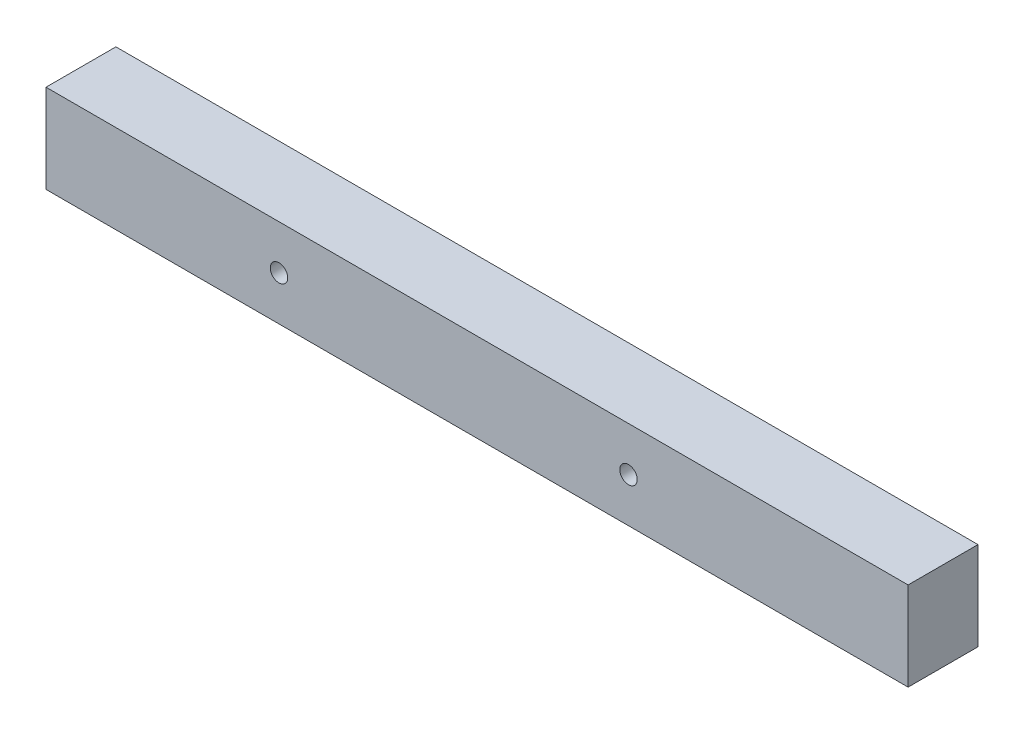
ISO-10303-21;
HEADER;
FILE_DESCRIPTION(('STEP AP214'),'2;1');
FILE_NAME('part.step','',(''),(''),'','','');
FILE_SCHEMA(('AUTOMOTIVE_DESIGN { 1 0 10303 214 1 1 1 1 }'));
ENDSEC;
DATA;
#1=APPLICATION_CONTEXT('core data for automotive mechanical design processes');
#2=APPLICATION_PROTOCOL_DEFINITION('international standard','automotive_design',2000,#1);
#3=PRODUCT_CONTEXT('',#1,'mechanical');
#4=PRODUCT('Part','Part','',(#3));
#5=PRODUCT_RELATED_PRODUCT_CATEGORY('part','',(#4));
#6=PRODUCT_DEFINITION_FORMATION('','',#4);
#7=PRODUCT_DEFINITION_CONTEXT('part definition',#1,'design');
#8=PRODUCT_DEFINITION('design','',#6,#7);
#9=PRODUCT_DEFINITION_SHAPE('','',#8);
#10=(LENGTH_UNIT() NAMED_UNIT(*) SI_UNIT(.MILLI.,.METRE.));
#11=(NAMED_UNIT(*) PLANE_ANGLE_UNIT() SI_UNIT($,.RADIAN.));
#12=(NAMED_UNIT(*) SI_UNIT($,.STERADIAN.) SOLID_ANGLE_UNIT());
#13=UNCERTAINTY_MEASURE_WITH_UNIT(LENGTH_MEASURE(1.E-05),#10,'distance_accuracy_value','');
#14=(GEOMETRIC_REPRESENTATION_CONTEXT(3) GLOBAL_UNCERTAINTY_ASSIGNED_CONTEXT((#13)) GLOBAL_UNIT_ASSIGNED_CONTEXT((#10,
#11,#12)) REPRESENTATION_CONTEXT('',''));
#15=CARTESIAN_POINT('',(0.,0.,0.));
#16=DIRECTION('',(0.,0.,1.));
#17=DIRECTION('',(1.,0.,0.));
#18=AXIS2_PLACEMENT_3D('',#15,#16,#17);
#19=CARTESIAN_POINT('',(0.,0.,3.));
#20=DIRECTION('',(0.,0.,1.));
#21=DIRECTION('',(1.,0.,0.));
#22=AXIS2_PLACEMENT_3D('',#19,#20,#21);
#23=PLANE('',#22);
#24=CARTESIAN_POINT('',(-12.,0.,3.));
#25=DIRECTION('',(0.,0.,1.));
#26=DIRECTION('',(1.,0.,0.));
#27=AXIS2_PLACEMENT_3D('',#24,#25,#26);
#28=CIRCLE('',#27,0.375000000000001);
#29=CARTESIAN_POINT('',(-11.625,0.,3.));
#30=VERTEX_POINT('',#29);
#31=EDGE_CURVE('E100',#30,#30,#28,.T.);
#32=ORIENTED_EDGE('',*,*,#31,.F.);
#33=EDGE_LOOP('',(#32));
#34=FACE_BOUND('',#33,.T.);
#35=DIRECTION('',(0.,-1.,0.));
#36=VECTOR('',#35,1.);
#37=CARTESIAN_POINT('',(-37.,1.9,3.));
#38=LINE('',#37,#36);
#39=CARTESIAN_POINT('',(-37.,1.9,3.));
#40=VERTEX_POINT('',#39);
#41=CARTESIAN_POINT('',(-37.,-1.9,3.));
#42=VERTEX_POINT('',#41);
#43=EDGE_CURVE('E85',#40,#42,#38,.T.);
#44=ORIENTED_EDGE('',*,*,#43,.T.);
#45=DIRECTION('',(1.,0.,0.));
#46=VECTOR('',#45,1.);
#47=CARTESIAN_POINT('',(-37.,-1.9,3.));
#48=LINE('',#47,#46);
#49=CARTESIAN_POINT('',(0.,-1.9,3.));
#50=VERTEX_POINT('',#49);
#51=EDGE_CURVE('E80',#42,#50,#48,.T.);
#52=ORIENTED_EDGE('',*,*,#51,.T.);
#53=DIRECTION('',(0.,1.,0.));
#54=VECTOR('',#53,1.);
#55=CARTESIAN_POINT('',(0.,1.9,3.));
#56=LINE('',#55,#54);
#57=CARTESIAN_POINT('',(0.,1.9,3.));
#58=VERTEX_POINT('',#57);
#59=EDGE_CURVE('E83',#50,#58,#56,.T.);
#60=ORIENTED_EDGE('',*,*,#59,.T.);
#61=DIRECTION('',(-1.,0.,0.));
#62=VECTOR('',#61,1.);
#63=CARTESIAN_POINT('',(-37.,1.9,3.));
#64=LINE('',#63,#62);
#65=EDGE_CURVE('E50',#58,#40,#64,.T.);
#66=ORIENTED_EDGE('',*,*,#65,.T.);
#67=EDGE_LOOP('',(#44,#52,#60,#66));
#68=FACE_BOUND('',#67,.T.);
#69=CARTESIAN_POINT('',(-27.,0.,3.));
#70=DIRECTION('',(0.,0.,1.));
#71=DIRECTION('',(1.,0.,0.));
#72=AXIS2_PLACEMENT_3D('',#69,#70,#71);
#73=CIRCLE('',#72,0.374999999999999);
#74=CARTESIAN_POINT('',(-26.625,0.,3.));
#75=VERTEX_POINT('',#74);
#76=EDGE_CURVE('E115',#75,#75,#73,.T.);
#77=ORIENTED_EDGE('',*,*,#76,.F.);
#78=EDGE_LOOP('',(#77));
#79=FACE_BOUND('',#78,.T.);
#80=ADVANCED_FACE('F33',(#34,#68,#79),#23,.T.);
#81=CARTESIAN_POINT('',(0.,0.,0.));
#82=DIRECTION('',(0.,0.,1.));
#83=DIRECTION('',(1.,0.,0.));
#84=AXIS2_PLACEMENT_3D('',#81,#82,#83);
#85=PLANE('',#84);
#86=DIRECTION('',(0.,-1.,0.));
#87=VECTOR('',#86,1.);
#88=CARTESIAN_POINT('',(-37.,1.9,0.));
#89=LINE('',#88,#87);
#90=CARTESIAN_POINT('',(-37.,1.9,0.));
#91=VERTEX_POINT('',#90);
#92=CARTESIAN_POINT('',(-37.,-1.9,0.));
#93=VERTEX_POINT('',#92);
#94=EDGE_CURVE('E97',#91,#93,#89,.T.);
#95=ORIENTED_EDGE('',*,*,#94,.F.);
#96=DIRECTION('',(-1.,0.,0.));
#97=VECTOR('',#96,1.);
#98=CARTESIAN_POINT('',(-37.,1.9,0.));
#99=LINE('',#98,#97);
#100=CARTESIAN_POINT('',(0.,1.9,0.));
#101=VERTEX_POINT('',#100);
#102=EDGE_CURVE('E73',#101,#91,#99,.T.);
#103=ORIENTED_EDGE('',*,*,#102,.F.);
#104=DIRECTION('',(0.,1.,0.));
#105=VECTOR('',#104,1.);
#106=CARTESIAN_POINT('',(0.,1.9,0.));
#107=LINE('',#106,#105);
#108=CARTESIAN_POINT('',(0.,-1.9,0.));
#109=VERTEX_POINT('',#108);
#110=EDGE_CURVE('E67',#109,#101,#107,.T.);
#111=ORIENTED_EDGE('',*,*,#110,.F.);
#112=DIRECTION('',(1.,0.,0.));
#113=VECTOR('',#112,1.);
#114=CARTESIAN_POINT('',(-37.,-1.9,0.));
#115=LINE('',#114,#113);
#116=EDGE_CURVE('E89',#93,#109,#115,.T.);
#117=ORIENTED_EDGE('',*,*,#116,.F.);
#118=EDGE_LOOP('',(#95,#103,#111,#117));
#119=FACE_BOUND('',#118,.T.);
#120=CARTESIAN_POINT('',(-12.,0.,0.));
#121=DIRECTION('',(0.,0.,1.));
#122=DIRECTION('',(1.,0.,0.));
#123=AXIS2_PLACEMENT_3D('',#120,#121,#122);
#124=CIRCLE('',#123,0.375000000000001);
#125=CARTESIAN_POINT('',(-11.625,0.,0.));
#126=VERTEX_POINT('',#125);
#127=EDGE_CURVE('E112',#126,#126,#124,.T.);
#128=ORIENTED_EDGE('',*,*,#127,.T.);
#129=EDGE_LOOP('',(#128));
#130=FACE_BOUND('',#129,.T.);
#131=CARTESIAN_POINT('',(-27.,0.,0.));
#132=DIRECTION('',(0.,0.,1.));
#133=DIRECTION('',(1.,0.,0.));
#134=AXIS2_PLACEMENT_3D('',#131,#132,#133);
#135=CIRCLE('',#134,0.374999999999999);
#136=CARTESIAN_POINT('',(-26.625,0.,0.));
#137=VERTEX_POINT('',#136);
#138=EDGE_CURVE('E118',#137,#137,#135,.T.);
#139=ORIENTED_EDGE('',*,*,#138,.T.);
#140=EDGE_LOOP('',(#139));
#141=FACE_BOUND('',#140,.T.);
#142=ADVANCED_FACE('F108',(#119,#130,#141),#85,.F.);
#143=CARTESIAN_POINT('',(-37.,1.9,3.));
#144=DIRECTION('',(1.,0.,0.));
#145=DIRECTION('',(0.,0.,-1.));
#146=AXIS2_PLACEMENT_3D('',#143,#144,#145);
#147=PLANE('',#146);
#148=ORIENTED_EDGE('',*,*,#94,.T.);
#149=DIRECTION('',(0.,0.,-1.));
#150=VECTOR('',#149,1.);
#151=CARTESIAN_POINT('',(-37.,-1.9,3.));
#152=LINE('',#151,#150);
#153=EDGE_CURVE('E11',#42,#93,#152,.T.);
#154=ORIENTED_EDGE('',*,*,#153,.F.);
#155=ORIENTED_EDGE('',*,*,#43,.F.);
#156=DIRECTION('',(0.,0.,-1.));
#157=VECTOR('',#156,1.);
#158=CARTESIAN_POINT('',(-37.,1.9,3.));
#159=LINE('',#158,#157);
#160=EDGE_CURVE('E93',#40,#91,#159,.T.);
#161=ORIENTED_EDGE('',*,*,#160,.T.);
#162=EDGE_LOOP('',(#148,#154,#155,#161));
#163=FACE_BOUND('',#162,.T.);
#164=ADVANCED_FACE('F35',(#163),#147,.F.);
#165=CARTESIAN_POINT('',(-37.,-1.9,3.));
#166=DIRECTION('',(0.,1.,0.));
#167=DIRECTION('',(0.,0.,1.));
#168=AXIS2_PLACEMENT_3D('',#165,#166,#167);
#169=PLANE('',#168);
#170=ORIENTED_EDGE('',*,*,#116,.T.);
#171=DIRECTION('',(0.,0.,-1.));
#172=VECTOR('',#171,1.);
#173=CARTESIAN_POINT('',(0.,-1.9,3.));
#174=LINE('',#173,#172);
#175=EDGE_CURVE('E42',#50,#109,#174,.T.);
#176=ORIENTED_EDGE('',*,*,#175,.F.);
#177=ORIENTED_EDGE('',*,*,#51,.F.);
#178=ORIENTED_EDGE('',*,*,#153,.T.);
#179=EDGE_LOOP('',(#170,#176,#177,#178));
#180=FACE_BOUND('',#179,.T.);
#181=ADVANCED_FACE('F88',(#180),#169,.F.);
#182=CARTESIAN_POINT('',(0.,1.9,3.));
#183=DIRECTION('',(-1.,0.,0.));
#184=DIRECTION('',(0.,0.,1.));
#185=AXIS2_PLACEMENT_3D('',#182,#183,#184);
#186=PLANE('',#185);
#187=ORIENTED_EDGE('',*,*,#110,.T.);
#188=DIRECTION('',(0.,0.,-1.));
#189=VECTOR('',#188,1.);
#190=CARTESIAN_POINT('',(0.,1.9,3.));
#191=LINE('',#190,#189);
#192=EDGE_CURVE('E90',#58,#101,#191,.T.);
#193=ORIENTED_EDGE('',*,*,#192,.F.);
#194=ORIENTED_EDGE('',*,*,#59,.F.);
#195=ORIENTED_EDGE('',*,*,#175,.T.);
#196=EDGE_LOOP('',(#187,#193,#194,#195));
#197=FACE_BOUND('',#196,.T.);
#198=ADVANCED_FACE('F91',(#197),#186,.F.);
#199=CARTESIAN_POINT('',(-37.,1.9,3.));
#200=DIRECTION('',(0.,-1.,0.));
#201=DIRECTION('',(0.,0.,-1.));
#202=AXIS2_PLACEMENT_3D('',#199,#200,#201);
#203=PLANE('',#202);
#204=ORIENTED_EDGE('',*,*,#102,.T.);
#205=ORIENTED_EDGE('',*,*,#160,.F.);
#206=ORIENTED_EDGE('',*,*,#65,.F.);
#207=ORIENTED_EDGE('',*,*,#192,.T.);
#208=EDGE_LOOP('',(#204,#205,#206,#207));
#209=FACE_BOUND('',#208,.T.);
#210=ADVANCED_FACE('F105',(#209),#203,.F.);
#211=CARTESIAN_POINT('',(-12.,0.,3.));
#212=DIRECTION('',(0.,0.,-1.));
#213=DIRECTION('',(-1.,0.,0.));
#214=AXIS2_PLACEMENT_3D('',#211,#212,#213);
#215=CYLINDRICAL_SURFACE('',#214,0.375000000000001);
#216=ORIENTED_EDGE('',*,*,#31,.T.);
#217=EDGE_LOOP('',(#216));
#218=FACE_BOUND('',#217,.T.);
#219=ORIENTED_EDGE('',*,*,#127,.F.);
#220=EDGE_LOOP('',(#219));
#221=FACE_BOUND('',#220,.T.);
#222=ADVANCED_FACE('F135',(#218,#221),#215,.F.);
#223=CARTESIAN_POINT('',(-27.,0.,3.));
#224=DIRECTION('',(0.,0.,-1.));
#225=DIRECTION('',(-1.,0.,0.));
#226=AXIS2_PLACEMENT_3D('',#223,#224,#225);
#227=CYLINDRICAL_SURFACE('',#226,0.374999999999999);
#228=ORIENTED_EDGE('',*,*,#76,.T.);
#229=EDGE_LOOP('',(#228));
#230=FACE_BOUND('',#229,.T.);
#231=ORIENTED_EDGE('',*,*,#138,.F.);
#232=EDGE_LOOP('',(#231));
#233=FACE_BOUND('',#232,.T.);
#234=ADVANCED_FACE('F124',(#230,#233),#227,.F.);
#235=CLOSED_SHELL('',(#80,#142,#164,#181,#198,#210,#222,#234));
#236=MANIFOLD_SOLID_BREP('B2',#235);
#237=ADVANCED_BREP_SHAPE_REPRESENTATION('',(#18,#236),#14);
#238=SHAPE_DEFINITION_REPRESENTATION(#9,#237);
ENDSEC;
END-ISO-10303-21;
